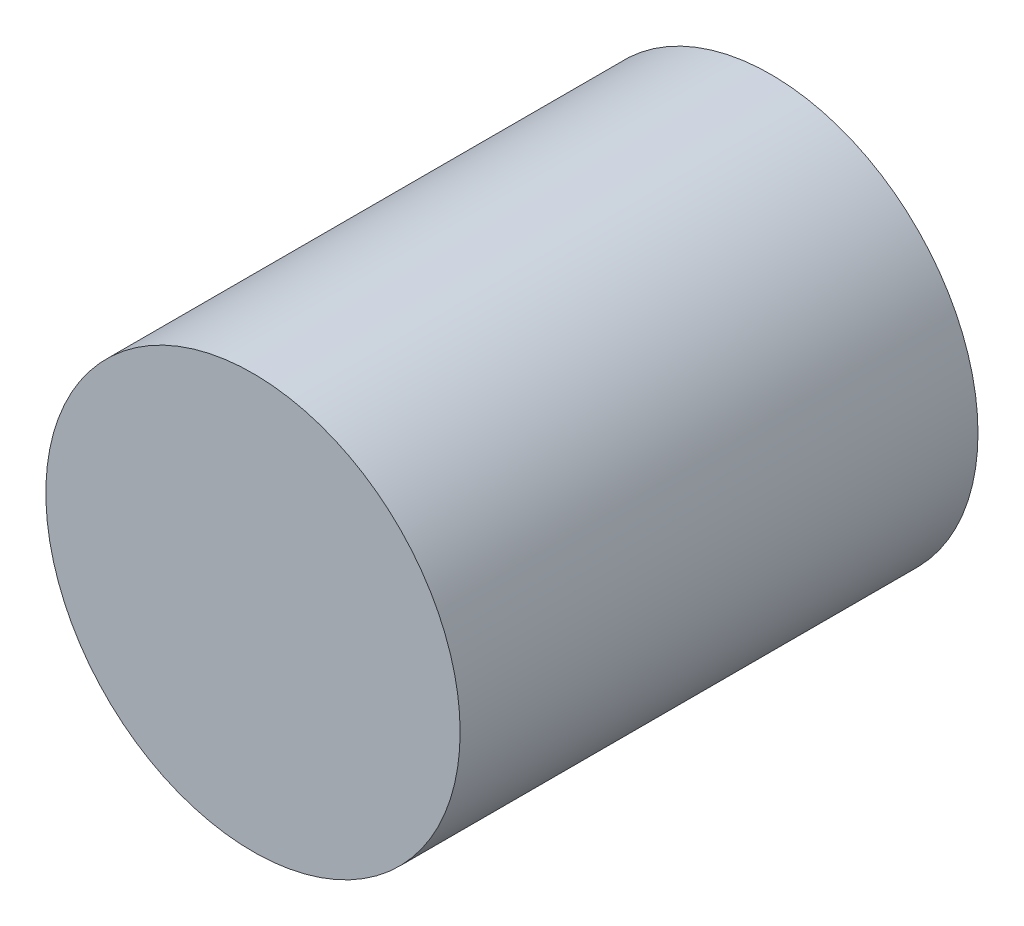
ISO-10303-21;
HEADER;
FILE_DESCRIPTION(('STEP AP214'),'2;1');
FILE_NAME('part.step','',(''),(''),'','','');
FILE_SCHEMA(('AUTOMOTIVE_DESIGN { 1 0 10303 214 1 1 1 1 }'));
ENDSEC;
DATA;
#1=APPLICATION_CONTEXT('core data for automotive mechanical design processes');
#2=APPLICATION_PROTOCOL_DEFINITION('international standard','automotive_design',2000,#1);
#3=PRODUCT_CONTEXT('',#1,'mechanical');
#4=PRODUCT('Part','Part','',(#3));
#5=PRODUCT_RELATED_PRODUCT_CATEGORY('part','',(#4));
#6=PRODUCT_DEFINITION_FORMATION('','',#4);
#7=PRODUCT_DEFINITION_CONTEXT('part definition',#1,'design');
#8=PRODUCT_DEFINITION('design','',#6,#7);
#9=PRODUCT_DEFINITION_SHAPE('','',#8);
#10=(LENGTH_UNIT() NAMED_UNIT(*) SI_UNIT(.MILLI.,.METRE.));
#11=(NAMED_UNIT(*) PLANE_ANGLE_UNIT() SI_UNIT($,.RADIAN.));
#12=(NAMED_UNIT(*) SI_UNIT($,.STERADIAN.) SOLID_ANGLE_UNIT());
#13=UNCERTAINTY_MEASURE_WITH_UNIT(LENGTH_MEASURE(1.E-05),#10,'distance_accuracy_value','');
#14=(GEOMETRIC_REPRESENTATION_CONTEXT(3) GLOBAL_UNCERTAINTY_ASSIGNED_CONTEXT((#13)) GLOBAL_UNIT_ASSIGNED_CONTEXT((#10,
#11,#12)) REPRESENTATION_CONTEXT('',''));
#15=CARTESIAN_POINT('',(0.,0.,0.));
#16=DIRECTION('',(0.,0.,1.));
#17=DIRECTION('',(1.,0.,0.));
#18=AXIS2_PLACEMENT_3D('',#15,#16,#17);
#19=CARTESIAN_POINT('',(0.,0.,-50.));
#20=DIRECTION('',(0.,0.,1.));
#21=DIRECTION('',(1.,0.,0.));
#22=AXIS2_PLACEMENT_3D('',#19,#20,#21);
#23=CYLINDRICAL_SURFACE('',#22,20.);
#24=CARTESIAN_POINT('',(0.,0.,-50.));
#25=DIRECTION('',(0.,0.,1.));
#26=DIRECTION('',(1.,0.,0.));
#27=AXIS2_PLACEMENT_3D('',#24,#25,#26);
#28=CIRCLE('',#27,20.);
#29=CARTESIAN_POINT('',(20.,0.,-50.));
#30=VERTEX_POINT('',#29);
#31=EDGE_CURVE('E10',#30,#30,#28,.T.);
#32=ORIENTED_EDGE('',*,*,#31,.T.);
#33=EDGE_LOOP('',(#32));
#34=FACE_BOUND('',#33,.T.);
#35=CARTESIAN_POINT('',(0.,0.,0.));
#36=DIRECTION('',(0.,0.,1.));
#37=DIRECTION('',(1.,0.,0.));
#38=AXIS2_PLACEMENT_3D('',#35,#36,#37);
#39=CIRCLE('',#38,20.);
#40=CARTESIAN_POINT('',(20.,0.,0.));
#41=VERTEX_POINT('',#40);
#42=EDGE_CURVE('E45',#41,#41,#39,.T.);
#43=ORIENTED_EDGE('',*,*,#42,.F.);
#44=EDGE_LOOP('',(#43));
#45=FACE_BOUND('',#44,.T.);
#46=ADVANCED_FACE('F39',(#34,#45),#23,.T.);
#47=CARTESIAN_POINT('',(0.,0.,-50.));
#48=DIRECTION('',(0.,0.,1.));
#49=DIRECTION('',(1.,0.,0.));
#50=AXIS2_PLACEMENT_3D('',#47,#48,#49);
#51=PLANE('',#50);
#52=ORIENTED_EDGE('',*,*,#31,.F.);
#53=EDGE_LOOP('',(#52));
#54=FACE_BOUND('',#53,.T.);
#55=ADVANCED_FACE('F53',(#54),#51,.F.);
#56=CARTESIAN_POINT('',(0.,0.,0.));
#57=DIRECTION('',(0.,0.,1.));
#58=DIRECTION('',(1.,0.,0.));
#59=AXIS2_PLACEMENT_3D('',#56,#57,#58);
#60=PLANE('',#59);
#61=ORIENTED_EDGE('',*,*,#42,.T.);
#62=EDGE_LOOP('',(#61));
#63=FACE_BOUND('',#62,.T.);
#64=ADVANCED_FACE('F51',(#63),#60,.T.);
#65=CLOSED_SHELL('',(#46,#55,#64));
#66=MANIFOLD_SOLID_BREP('B2',#65);
#67=ADVANCED_BREP_SHAPE_REPRESENTATION('',(#18,#66),#14);
#68=SHAPE_DEFINITION_REPRESENTATION(#9,#67);
ENDSEC;
END-ISO-10303-21;
